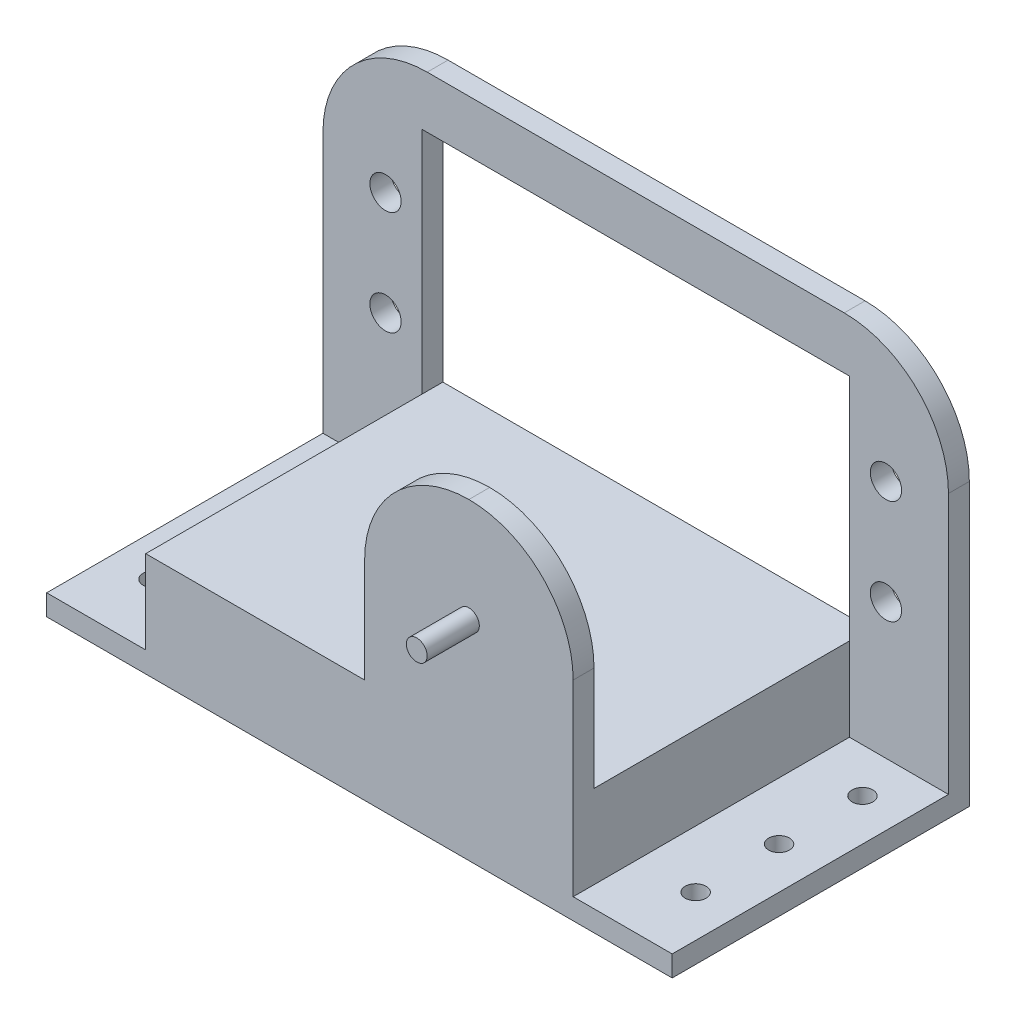
ISO-10303-21;
HEADER;
FILE_DESCRIPTION(('STEP AP214'),'2;1');
FILE_NAME('part.step','',(''),(''),'','','');
FILE_SCHEMA(('AUTOMOTIVE_DESIGN { 1 0 10303 214 1 1 1 1 }'));
ENDSEC;
DATA;
#1=APPLICATION_CONTEXT('core data for automotive mechanical design processes');
#2=APPLICATION_PROTOCOL_DEFINITION('international standard','automotive_design',2000,#1);
#3=PRODUCT_CONTEXT('',#1,'mechanical');
#4=PRODUCT('Part','Part','',(#3));
#5=PRODUCT_RELATED_PRODUCT_CATEGORY('part','',(#4));
#6=PRODUCT_DEFINITION_FORMATION('','',#4);
#7=PRODUCT_DEFINITION_CONTEXT('part definition',#1,'design');
#8=PRODUCT_DEFINITION('design','',#6,#7);
#9=PRODUCT_DEFINITION_SHAPE('','',#8);
#10=(LENGTH_UNIT() NAMED_UNIT(*) SI_UNIT(.MILLI.,.METRE.));
#11=(NAMED_UNIT(*) PLANE_ANGLE_UNIT() SI_UNIT($,.RADIAN.));
#12=(NAMED_UNIT(*) SI_UNIT($,.STERADIAN.) SOLID_ANGLE_UNIT());
#13=UNCERTAINTY_MEASURE_WITH_UNIT(LENGTH_MEASURE(1.E-05),#10,'distance_accuracy_value','');
#14=(GEOMETRIC_REPRESENTATION_CONTEXT(3) GLOBAL_UNCERTAINTY_ASSIGNED_CONTEXT((#13)) GLOBAL_UNIT_ASSIGNED_CONTEXT((#10,
#11,#12)) REPRESENTATION_CONTEXT('',''));
#15=CARTESIAN_POINT('',(0.,0.,0.));
#16=DIRECTION('',(0.,0.,1.));
#17=DIRECTION('',(1.,0.,0.));
#18=AXIS2_PLACEMENT_3D('',#15,#16,#17);
#19=CARTESIAN_POINT('',(0.,10.,0.));
#20=DIRECTION('',(0.,1.,0.));
#21=DIRECTION('',(0.,0.,1.));
#22=AXIS2_PLACEMENT_3D('',#19,#20,#21);
#23=PLANE('',#22);
#24=DIRECTION('',(0.,0.,1.));
#25=VECTOR('',#24,1.);
#26=CARTESIAN_POINT('',(0.499999999999994,10.,14.25));
#27=LINE('',#26,#25);
#28=CARTESIAN_POINT('',(0.499999999999994,10.,12.25));
#29=VERTEX_POINT('',#28);
#30=CARTESIAN_POINT('',(0.499999999999994,10.,14.25));
#31=VERTEX_POINT('',#30);
#32=EDGE_CURVE('E203',#29,#31,#27,.T.);
#33=ORIENTED_EDGE('',*,*,#32,.F.);
#34=DIRECTION('',(-1.,0.,0.));
#35=VECTOR('',#34,1.);
#36=CARTESIAN_POINT('',(20.5,10.,12.25));
#37=LINE('',#36,#35);
#38=CARTESIAN_POINT('',(20.5,10.,12.25));
#39=VERTEX_POINT('',#38);
#40=EDGE_CURVE('E200',#39,#29,#37,.T.);
#41=ORIENTED_EDGE('',*,*,#40,.F.);
#42=DIRECTION('',(0.,0.,-1.));
#43=VECTOR('',#42,1.);
#44=CARTESIAN_POINT('',(20.5,10.,-14.25));
#45=LINE('',#44,#43);
#46=CARTESIAN_POINT('',(20.5,10.,-12.25));
#47=VERTEX_POINT('',#46);
#48=EDGE_CURVE('E220',#39,#47,#45,.T.);
#49=ORIENTED_EDGE('',*,*,#48,.T.);
#50=DIRECTION('',(0.,0.,-1.));
#51=VECTOR('',#50,1.);
#52=CARTESIAN_POINT('',(20.5,10.,34.2795604965274));
#53=LINE('',#52,#51);
#54=CARTESIAN_POINT('',(20.5,10.,-14.25));
#55=VERTEX_POINT('',#54);
#56=EDGE_CURVE('E178',#47,#55,#53,.T.);
#57=ORIENTED_EDGE('',*,*,#56,.T.);
#58=DIRECTION('',(-1.,0.,0.));
#59=VECTOR('',#58,1.);
#60=CARTESIAN_POINT('',(20.5,10.,-14.25));
#61=LINE('',#60,#59);
#62=CARTESIAN_POINT('',(-20.5,10.,-14.25));
#63=VERTEX_POINT('',#62);
#64=EDGE_CURVE('E182',#55,#63,#61,.T.);
#65=ORIENTED_EDGE('',*,*,#64,.T.);
#66=DIRECTION('',(0.,0.,-1.));
#67=VECTOR('',#66,1.);
#68=CARTESIAN_POINT('',(-20.5,10.,34.2795604965274));
#69=LINE('',#68,#67);
#70=CARTESIAN_POINT('',(-20.5,10.,-12.25));
#71=VERTEX_POINT('',#70);
#72=EDGE_CURVE('E166',#71,#63,#69,.T.);
#73=ORIENTED_EDGE('',*,*,#72,.F.);
#74=DIRECTION('',(0.,0.,1.));
#75=VECTOR('',#74,1.);
#76=CARTESIAN_POINT('',(-20.5,10.,-14.25));
#77=LINE('',#76,#75);
#78=CARTESIAN_POINT('',(-20.5,10.,14.25));
#79=VERTEX_POINT('',#78);
#80=EDGE_CURVE('E214',#71,#79,#77,.T.);
#81=ORIENTED_EDGE('',*,*,#80,.T.);
#82=DIRECTION('',(1.,0.,0.));
#83=VECTOR('',#82,1.);
#84=CARTESIAN_POINT('',(-20.5,10.,14.25));
#85=LINE('',#84,#83);
#86=EDGE_CURVE('E216',#79,#31,#85,.T.);
#87=ORIENTED_EDGE('',*,*,#86,.T.);
#88=EDGE_LOOP('',(#33,#41,#49,#57,#65,#73,#81,#87));
#89=FACE_BOUND('',#88,.T.);
#90=ADVANCED_FACE('F35',(#89),#23,.T.);
#91=CARTESIAN_POINT('',(0.,2.,0.));
#92=DIRECTION('',(0.,1.,0.));
#93=DIRECTION('',(0.,0.,1.));
#94=AXIS2_PLACEMENT_3D('',#91,#92,#93);
#95=PLANE('',#94);
#96=CARTESIAN_POINT('',(-26.,2.,-8.));
#97=DIRECTION('',(0.,1.,0.));
#98=DIRECTION('',(0.,0.,1.));
#99=AXIS2_PLACEMENT_3D('',#96,#97,#98);
#100=CIRCLE('',#99,1.);
#101=CARTESIAN_POINT('',(-26.,2.,-7.));
#102=VERTEX_POINT('',#101);
#103=EDGE_CURVE('E412',#102,#102,#100,.T.);
#104=ORIENTED_EDGE('',*,*,#103,.F.);
#105=EDGE_LOOP('',(#104));
#106=FACE_BOUND('',#105,.T.);
#107=CARTESIAN_POINT('',(-26.,2.,8.));
#108=DIRECTION('',(0.,1.,0.));
#109=DIRECTION('',(0.,0.,-1.));
#110=AXIS2_PLACEMENT_3D('',#107,#108,#109);
#111=CIRCLE('',#110,1.);
#112=CARTESIAN_POINT('',(-26.,2.,7.));
#113=VERTEX_POINT('',#112);
#114=EDGE_CURVE('E413',#113,#113,#111,.T.);
#115=ORIENTED_EDGE('',*,*,#114,.F.);
#116=EDGE_LOOP('',(#115));
#117=FACE_BOUND('',#116,.T.);
#118=CARTESIAN_POINT('',(-26.,2.,0.));
#119=DIRECTION('',(0.,1.,0.));
#120=DIRECTION('',(0.,0.,1.));
#121=AXIS2_PLACEMENT_3D('',#118,#119,#120);
#122=CIRCLE('',#121,1.);
#123=CARTESIAN_POINT('',(-26.,2.,1.));
#124=VERTEX_POINT('',#123);
#125=EDGE_CURVE('E405',#124,#124,#122,.T.);
#126=ORIENTED_EDGE('',*,*,#125,.F.);
#127=EDGE_LOOP('',(#126));
#128=FACE_BOUND('',#127,.T.);
#129=DIRECTION('',(1.,0.,0.));
#130=VECTOR('',#129,1.);
#131=CARTESIAN_POINT('',(-30.,2.,14.25));
#132=LINE('',#131,#130);
#133=CARTESIAN_POINT('',(-30.,2.,14.25));
#134=VERTEX_POINT('',#133);
#135=CARTESIAN_POINT('',(-20.5,2.,14.25));
#136=VERTEX_POINT('',#135);
#137=EDGE_CURVE('E251',#134,#136,#132,.T.);
#138=ORIENTED_EDGE('',*,*,#137,.T.);
#139=DIRECTION('',(0.,0.,1.));
#140=VECTOR('',#139,1.);
#141=CARTESIAN_POINT('',(-20.5,2.,-14.25));
#142=LINE('',#141,#140);
#143=CARTESIAN_POINT('',(-20.5,2.,-12.25));
#144=VERTEX_POINT('',#143);
#145=EDGE_CURVE('E213',#144,#136,#142,.T.);
#146=ORIENTED_EDGE('',*,*,#145,.F.);
#147=DIRECTION('',(1.,0.,0.));
#148=VECTOR('',#147,1.);
#149=CARTESIAN_POINT('',(-30.,2.,-12.25));
#150=LINE('',#149,#148);
#151=CARTESIAN_POINT('',(-30.,2.,-12.25));
#152=VERTEX_POINT('',#151);
#153=EDGE_CURVE('E234',#152,#144,#150,.T.);
#154=ORIENTED_EDGE('',*,*,#153,.F.);
#155=DIRECTION('',(0.,0.,1.));
#156=VECTOR('',#155,1.);
#157=CARTESIAN_POINT('',(-30.,2.,-14.25));
#158=LINE('',#157,#156);
#159=EDGE_CURVE('E247',#152,#134,#158,.T.);
#160=ORIENTED_EDGE('',*,*,#159,.T.);
#161=EDGE_LOOP('',(#138,#146,#154,#160));
#162=FACE_BOUND('',#161,.T.);
#163=ADVANCED_FACE('F325',(#106,#117,#128,#162),#95,.T.);
#164=CARTESIAN_POINT('',(26.,2.,-8.));
#165=DIRECTION('',(0.,-1.,0.));
#166=DIRECTION('',(0.,0.,1.));
#167=AXIS2_PLACEMENT_3D('',#164,#165,#166);
#168=CIRCLE('',#167,1.);
#169=CARTESIAN_POINT('',(26.,2.,-7.));
#170=VERTEX_POINT('',#169);
#171=EDGE_CURVE('E430',#170,#170,#168,.T.);
#172=ORIENTED_EDGE('',*,*,#171,.T.);
#173=EDGE_LOOP('',(#172));
#174=FACE_BOUND('',#173,.T.);
#175=CARTESIAN_POINT('',(26.,2.,8.));
#176=DIRECTION('',(0.,-1.,0.));
#177=DIRECTION('',(0.,0.,-1.));
#178=AXIS2_PLACEMENT_3D('',#175,#176,#177);
#179=CIRCLE('',#178,1.);
#180=CARTESIAN_POINT('',(26.,2.,7.));
#181=VERTEX_POINT('',#180);
#182=EDGE_CURVE('E431',#181,#181,#179,.T.);
#183=ORIENTED_EDGE('',*,*,#182,.T.);
#184=EDGE_LOOP('',(#183));
#185=FACE_BOUND('',#184,.T.);
#186=CARTESIAN_POINT('',(26.,2.,0.));
#187=DIRECTION('',(0.,-1.,0.));
#188=DIRECTION('',(0.,0.,1.));
#189=AXIS2_PLACEMENT_3D('',#186,#187,#188);
#190=CIRCLE('',#189,1.);
#191=CARTESIAN_POINT('',(26.,2.,1.));
#192=VERTEX_POINT('',#191);
#193=EDGE_CURVE('E423',#192,#192,#190,.T.);
#194=ORIENTED_EDGE('',*,*,#193,.T.);
#195=EDGE_LOOP('',(#194));
#196=FACE_BOUND('',#195,.T.);
#197=CARTESIAN_POINT('',(20.5,2.,-12.25));
#198=VERTEX_POINT('',#197);
#199=CARTESIAN_POINT('',(30.,2.,-12.25));
#200=VERTEX_POINT('',#199);
#201=EDGE_CURVE('E229',#198,#200,#150,.T.);
#202=ORIENTED_EDGE('',*,*,#201,.F.);
#203=DIRECTION('',(0.,0.,-1.));
#204=VECTOR('',#203,1.);
#205=CARTESIAN_POINT('',(20.5,2.,-14.25));
#206=LINE('',#205,#204);
#207=CARTESIAN_POINT('',(20.5,2.,14.25));
#208=VERTEX_POINT('',#207);
#209=EDGE_CURVE('E217',#208,#198,#206,.T.);
#210=ORIENTED_EDGE('',*,*,#209,.F.);
#211=CARTESIAN_POINT('',(30.,2.,14.25));
#212=VERTEX_POINT('',#211);
#213=EDGE_CURVE('E250',#208,#212,#132,.T.);
#214=ORIENTED_EDGE('',*,*,#213,.T.);
#215=DIRECTION('',(0.,0.,-1.));
#216=VECTOR('',#215,1.);
#217=CARTESIAN_POINT('',(30.,2.,-14.25));
#218=LINE('',#217,#216);
#219=EDGE_CURVE('E244',#212,#200,#218,.T.);
#220=ORIENTED_EDGE('',*,*,#219,.T.);
#221=EDGE_LOOP('',(#202,#210,#214,#220));
#222=FACE_BOUND('',#221,.T.);
#223=ADVANCED_FACE('F362',(#174,#185,#196,#222),#95,.T.);
#224=CARTESIAN_POINT('',(-30.,37.,-12.25));
#225=DIRECTION('',(0.,0.,-1.));
#226=DIRECTION('',(-1.,0.,0.));
#227=AXIS2_PLACEMENT_3D('',#224,#225,#226);
#228=PLANE('',#227);
#229=CARTESIAN_POINT('',(-24.,15.,-12.25));
#230=DIRECTION('',(0.,0.,-1.));
#231=DIRECTION('',(-1.,0.,0.));
#232=AXIS2_PLACEMENT_3D('',#229,#230,#231);
#233=CIRCLE('',#232,1.5);
#234=CARTESIAN_POINT('',(-25.5,15.,-12.25));
#235=VERTEX_POINT('',#234);
#236=EDGE_CURVE('E395',#235,#235,#233,.T.);
#237=ORIENTED_EDGE('',*,*,#236,.T.);
#238=EDGE_LOOP('',(#237));
#239=FACE_BOUND('',#238,.T.);
#240=CARTESIAN_POINT('',(-24.,25.,-12.25));
#241=DIRECTION('',(0.,0.,-1.));
#242=DIRECTION('',(-1.,0.,0.));
#243=AXIS2_PLACEMENT_3D('',#240,#241,#242);
#244=CIRCLE('',#243,1.5);
#245=CARTESIAN_POINT('',(-25.5,25.,-12.25));
#246=VERTEX_POINT('',#245);
#247=EDGE_CURVE('E389',#246,#246,#244,.T.);
#248=ORIENTED_EDGE('',*,*,#247,.T.);
#249=EDGE_LOOP('',(#248));
#250=FACE_BOUND('',#249,.T.);
#251=CARTESIAN_POINT('',(24.,15.,-12.25));
#252=DIRECTION('',(0.,0.,-1.));
#253=DIRECTION('',(-1.,0.,0.));
#254=AXIS2_PLACEMENT_3D('',#251,#252,#253);
#255=CIRCLE('',#254,1.5);
#256=CARTESIAN_POINT('',(22.5,15.,-12.25));
#257=VERTEX_POINT('',#256);
#258=EDGE_CURVE('E381',#257,#257,#255,.F.);
#259=ORIENTED_EDGE('',*,*,#258,.F.);
#260=EDGE_LOOP('',(#259));
#261=FACE_BOUND('',#260,.T.);
#262=CARTESIAN_POINT('',(24.,25.,-12.25));
#263=DIRECTION('',(0.,0.,-1.));
#264=DIRECTION('',(-1.,0.,0.));
#265=AXIS2_PLACEMENT_3D('',#262,#263,#264);
#266=CIRCLE('',#265,1.5);
#267=CARTESIAN_POINT('',(22.5,25.,-12.25));
#268=VERTEX_POINT('',#267);
#269=EDGE_CURVE('E374',#268,#268,#266,.F.);
#270=ORIENTED_EDGE('',*,*,#269,.F.);
#271=EDGE_LOOP('',(#270));
#272=FACE_BOUND('',#271,.T.);
#273=DIRECTION('',(1.,0.,0.));
#274=VECTOR('',#273,1.);
#275=CARTESIAN_POINT('',(-30.,37.,-12.25));
#276=LINE('',#275,#274);
#277=CARTESIAN_POINT('',(-20.,37.,-12.25));
#278=VERTEX_POINT('',#277);
#279=CARTESIAN_POINT('',(20.,37.,-12.25));
#280=VERTEX_POINT('',#279);
#281=EDGE_CURVE('E230',#278,#280,#276,.T.);
#282=ORIENTED_EDGE('',*,*,#281,.F.);
#283=CARTESIAN_POINT('',(-20.,27.,-12.25));
#284=DIRECTION('',(0.,0.,-1.));
#285=DIRECTION('',(-1.,0.,0.));
#286=AXIS2_PLACEMENT_3D('',#283,#284,#285);
#287=CIRCLE('',#286,10.);
#288=CARTESIAN_POINT('',(-30.,27.,-12.25));
#289=VERTEX_POINT('',#288);
#290=EDGE_CURVE('E306',#278,#289,#287,.F.);
#291=ORIENTED_EDGE('',*,*,#290,.T.);
#292=DIRECTION('',(0.,-1.,0.));
#293=VECTOR('',#292,1.);
#294=CARTESIAN_POINT('',(-30.,37.,-12.25));
#295=LINE('',#294,#293);
#296=EDGE_CURVE('E241',#289,#152,#295,.T.);
#297=ORIENTED_EDGE('',*,*,#296,.T.);
#298=ORIENTED_EDGE('',*,*,#153,.T.);
#299=DIRECTION('',(0.,-1.,0.));
#300=VECTOR('',#299,1.);
#301=CARTESIAN_POINT('',(-20.5,37.,-12.25));
#302=LINE('',#301,#300);
#303=EDGE_CURVE('E275',#71,#144,#302,.T.);
#304=ORIENTED_EDGE('',*,*,#303,.F.);
#305=DIRECTION('',(0.,-1.,0.));
#306=VECTOR('',#305,1.);
#307=CARTESIAN_POINT('',(-20.5,10.,-12.25));
#308=LINE('',#307,#306);
#309=CARTESIAN_POINT('',(-20.5,32.,-12.25));
#310=VERTEX_POINT('',#309);
#311=EDGE_CURVE('E174',#310,#71,#308,.T.);
#312=ORIENTED_EDGE('',*,*,#311,.F.);
#313=DIRECTION('',(-1.,0.,0.));
#314=VECTOR('',#313,1.);
#315=CARTESIAN_POINT('',(20.5,32.,-12.25));
#316=LINE('',#315,#314);
#317=CARTESIAN_POINT('',(20.5,32.,-12.25));
#318=VERTEX_POINT('',#317);
#319=EDGE_CURVE('E367',#318,#310,#316,.T.);
#320=ORIENTED_EDGE('',*,*,#319,.F.);
#321=DIRECTION('',(0.,1.,0.));
#322=VECTOR('',#321,1.);
#323=CARTESIAN_POINT('',(20.5,10.,-12.25));
#324=LINE('',#323,#322);
#325=EDGE_CURVE('E204',#47,#318,#324,.T.);
#326=ORIENTED_EDGE('',*,*,#325,.F.);
#327=DIRECTION('',(0.,1.,0.));
#328=VECTOR('',#327,1.);
#329=CARTESIAN_POINT('',(20.5,37.,-12.25));
#330=LINE('',#329,#328);
#331=EDGE_CURVE('E272',#198,#47,#330,.T.);
#332=ORIENTED_EDGE('',*,*,#331,.F.);
#333=ORIENTED_EDGE('',*,*,#201,.T.);
#334=DIRECTION('',(0.,-1.,0.));
#335=VECTOR('',#334,1.);
#336=CARTESIAN_POINT('',(30.,37.,-12.25));
#337=LINE('',#336,#335);
#338=CARTESIAN_POINT('',(30.,27.,-12.25));
#339=VERTEX_POINT('',#338);
#340=EDGE_CURVE('E237',#339,#200,#337,.T.);
#341=ORIENTED_EDGE('',*,*,#340,.F.);
#342=CARTESIAN_POINT('',(20.,27.,-12.25));
#343=DIRECTION('',(0.,0.,-1.));
#344=DIRECTION('',(-1.,0.,0.));
#345=AXIS2_PLACEMENT_3D('',#342,#343,#344);
#346=CIRCLE('',#345,10.);
#347=EDGE_CURVE('E304',#339,#280,#346,.F.);
#348=ORIENTED_EDGE('',*,*,#347,.T.);
#349=EDGE_LOOP('',(#282,#291,#297,#298,#304,#312,#320,#326,#332,#333,#341,#348));
#350=FACE_BOUND('',#349,.T.);
#351=ADVANCED_FACE('F318',(#239,#250,#261,#272,#350),#228,.F.);
#352=CARTESIAN_POINT('',(30.,2.,-14.25));
#353=DIRECTION('',(-1.,0.,0.));
#354=DIRECTION('',(0.,0.,1.));
#355=AXIS2_PLACEMENT_3D('',#352,#353,#354);
#356=PLANE('',#355);
#357=DIRECTION('',(0.,-1.,0.));
#358=VECTOR('',#357,1.);
#359=CARTESIAN_POINT('',(30.,2.,-14.25));
#360=LINE('',#359,#358);
#361=CARTESIAN_POINT('',(30.,27.,-14.25));
#362=VERTEX_POINT('',#361);
#363=CARTESIAN_POINT('',(30.,0.,-14.25));
#364=VERTEX_POINT('',#363);
#365=EDGE_CURVE('E270',#362,#364,#360,.T.);
#366=ORIENTED_EDGE('',*,*,#365,.F.);
#367=DIRECTION('',(0.,0.,-1.));
#368=VECTOR('',#367,1.);
#369=CARTESIAN_POINT('',(30.,27.,-12.25));
#370=LINE('',#369,#368);
#371=EDGE_CURVE('E11',#362,#339,#370,.F.);
#372=ORIENTED_EDGE('',*,*,#371,.T.);
#373=ORIENTED_EDGE('',*,*,#340,.T.);
#374=ORIENTED_EDGE('',*,*,#219,.F.);
#375=DIRECTION('',(0.,-1.,0.));
#376=VECTOR('',#375,1.);
#377=CARTESIAN_POINT('',(30.,2.,14.25));
#378=LINE('',#377,#376);
#379=CARTESIAN_POINT('',(30.,0.,14.25));
#380=VERTEX_POINT('',#379);
#381=EDGE_CURVE('E254',#212,#380,#378,.T.);
#382=ORIENTED_EDGE('',*,*,#381,.T.);
#383=DIRECTION('',(0.,0.,-1.));
#384=VECTOR('',#383,1.);
#385=CARTESIAN_POINT('',(30.,0.,-14.25));
#386=LINE('',#385,#384);
#387=EDGE_CURVE('E243',#380,#364,#386,.T.);
#388=ORIENTED_EDGE('',*,*,#387,.T.);
#389=EDGE_LOOP('',(#366,#372,#373,#374,#382,#388));
#390=FACE_BOUND('',#389,.T.);
#391=ADVANCED_FACE('F471',(#390),#356,.F.);
#392=CARTESIAN_POINT('',(-30.,2.,-14.25));
#393=DIRECTION('',(0.,0.,1.));
#394=DIRECTION('',(1.,0.,0.));
#395=AXIS2_PLACEMENT_3D('',#392,#393,#394);
#396=PLANE('',#395);
#397=CARTESIAN_POINT('',(-24.,15.,-14.25));
#398=DIRECTION('',(0.,0.,1.));
#399=DIRECTION('',(-1.,0.,0.));
#400=AXIS2_PLACEMENT_3D('',#397,#398,#399);
#401=CIRCLE('',#400,1.5);
#402=CARTESIAN_POINT('',(-25.5,15.,-14.25));
#403=VERTEX_POINT('',#402);
#404=EDGE_CURVE('E398',#403,#403,#401,.T.);
#405=ORIENTED_EDGE('',*,*,#404,.T.);
#406=EDGE_LOOP('',(#405));
#407=FACE_BOUND('',#406,.T.);
#408=CARTESIAN_POINT('',(-24.,25.,-14.25));
#409=DIRECTION('',(0.,0.,1.));
#410=DIRECTION('',(1.,0.,0.));
#411=AXIS2_PLACEMENT_3D('',#408,#409,#410);
#412=CIRCLE('',#411,1.5);
#413=CARTESIAN_POINT('',(-22.5,25.,-14.25));
#414=VERTEX_POINT('',#413);
#415=EDGE_CURVE('E392',#414,#414,#412,.T.);
#416=ORIENTED_EDGE('',*,*,#415,.T.);
#417=EDGE_LOOP('',(#416));
#418=FACE_BOUND('',#417,.T.);
#419=CARTESIAN_POINT('',(24.,15.,-14.25));
#420=DIRECTION('',(0.,0.,-1.));
#421=DIRECTION('',(1.,0.,0.));
#422=AXIS2_PLACEMENT_3D('',#419,#420,#421);
#423=CIRCLE('',#422,1.5);
#424=CARTESIAN_POINT('',(25.5,15.,-14.25));
#425=VERTEX_POINT('',#424);
#426=EDGE_CURVE('E386',#425,#425,#423,.T.);
#427=ORIENTED_EDGE('',*,*,#426,.F.);
#428=EDGE_LOOP('',(#427));
#429=FACE_BOUND('',#428,.T.);
#430=CARTESIAN_POINT('',(24.,25.,-14.25));
#431=DIRECTION('',(0.,0.,-1.));
#432=DIRECTION('',(-1.,0.,0.));
#433=AXIS2_PLACEMENT_3D('',#430,#431,#432);
#434=CIRCLE('',#433,1.5);
#435=CARTESIAN_POINT('',(22.5,25.,-14.25));
#436=VERTEX_POINT('',#435);
#437=EDGE_CURVE('E376',#436,#436,#434,.T.);
#438=ORIENTED_EDGE('',*,*,#437,.F.);
#439=EDGE_LOOP('',(#438));
#440=FACE_BOUND('',#439,.T.);
#441=ORIENTED_EDGE('',*,*,#64,.F.);
#442=DIRECTION('',(0.,-1.,0.));
#443=VECTOR('',#442,1.);
#444=CARTESIAN_POINT('',(20.5,10.,-14.25));
#445=LINE('',#444,#443);
#446=CARTESIAN_POINT('',(20.5,32.,-14.25));
#447=VERTEX_POINT('',#446);
#448=EDGE_CURVE('E187',#447,#55,#445,.T.);
#449=ORIENTED_EDGE('',*,*,#448,.F.);
#450=DIRECTION('',(1.,0.,0.));
#451=VECTOR('',#450,1.);
#452=CARTESIAN_POINT('',(20.5,32.,-14.25));
#453=LINE('',#452,#451);
#454=CARTESIAN_POINT('',(-20.5,32.,-14.25));
#455=VERTEX_POINT('',#454);
#456=EDGE_CURVE('E191',#455,#447,#453,.T.);
#457=ORIENTED_EDGE('',*,*,#456,.F.);
#458=DIRECTION('',(0.,1.,0.));
#459=VECTOR('',#458,1.);
#460=CARTESIAN_POINT('',(-20.5,10.,-14.25));
#461=LINE('',#460,#459);
#462=EDGE_CURVE('E171',#63,#455,#461,.T.);
#463=ORIENTED_EDGE('',*,*,#462,.F.);
#464=EDGE_LOOP('',(#441,#449,#457,#463));
#465=FACE_BOUND('',#464,.T.);
#466=DIRECTION('',(0.,-1.,0.));
#467=VECTOR('',#466,1.);
#468=CARTESIAN_POINT('',(-30.,2.,-14.25));
#469=LINE('',#468,#467);
#470=CARTESIAN_POINT('',(-30.,27.,-14.25));
#471=VERTEX_POINT('',#470);
#472=CARTESIAN_POINT('',(-30.,0.,-14.25));
#473=VERTEX_POINT('',#472);
#474=EDGE_CURVE('E268',#471,#473,#469,.T.);
#475=ORIENTED_EDGE('',*,*,#474,.F.);
#476=CARTESIAN_POINT('',(-20.,27.,-14.25));
#477=DIRECTION('',(0.,0.,1.));
#478=DIRECTION('',(1.,0.,0.));
#479=AXIS2_PLACEMENT_3D('',#476,#477,#478);
#480=CIRCLE('',#479,10.);
#481=CARTESIAN_POINT('',(-20.,37.,-14.25));
#482=VERTEX_POINT('',#481);
#483=EDGE_CURVE('E43',#471,#482,#480,.F.);
#484=ORIENTED_EDGE('',*,*,#483,.T.);
#485=DIRECTION('',(-1.,0.,0.));
#486=VECTOR('',#485,1.);
#487=CARTESIAN_POINT('',(-30.,37.,-14.25));
#488=LINE('',#487,#486);
#489=CARTESIAN_POINT('',(20.,37.,-14.25));
#490=VERTEX_POINT('',#489);
#491=EDGE_CURVE('E233',#490,#482,#488,.T.);
#492=ORIENTED_EDGE('',*,*,#491,.F.);
#493=CARTESIAN_POINT('',(20.,27.,-14.25));
#494=DIRECTION('',(0.,0.,1.));
#495=DIRECTION('',(1.,0.,0.));
#496=AXIS2_PLACEMENT_3D('',#493,#494,#495);
#497=CIRCLE('',#496,10.);
#498=EDGE_CURVE('E50',#490,#362,#497,.F.);
#499=ORIENTED_EDGE('',*,*,#498,.T.);
#500=ORIENTED_EDGE('',*,*,#365,.T.);
#501=DIRECTION('',(-1.,0.,0.));
#502=VECTOR('',#501,1.);
#503=CARTESIAN_POINT('',(-30.,0.,-14.25));
#504=LINE('',#503,#502);
#505=EDGE_CURVE('E257',#364,#473,#504,.T.);
#506=ORIENTED_EDGE('',*,*,#505,.T.);
#507=EDGE_LOOP('',(#475,#484,#492,#499,#500,#506));
#508=FACE_BOUND('',#507,.T.);
#509=ADVANCED_FACE('F189',(#407,#418,#429,#440,#465,#508),#396,.F.);
#510=CARTESIAN_POINT('',(-30.,2.,-14.25));
#511=DIRECTION('',(1.,0.,0.));
#512=DIRECTION('',(0.,0.,-1.));
#513=AXIS2_PLACEMENT_3D('',#510,#511,#512);
#514=PLANE('',#513);
#515=ORIENTED_EDGE('',*,*,#296,.F.);
#516=DIRECTION('',(0.,0.,1.));
#517=VECTOR('',#516,1.);
#518=CARTESIAN_POINT('',(-30.,27.,-14.25));
#519=LINE('',#518,#517);
#520=EDGE_CURVE('E58',#289,#471,#519,.F.);
#521=ORIENTED_EDGE('',*,*,#520,.T.);
#522=ORIENTED_EDGE('',*,*,#474,.T.);
#523=DIRECTION('',(0.,0.,1.));
#524=VECTOR('',#523,1.);
#525=CARTESIAN_POINT('',(-30.,0.,-14.25));
#526=LINE('',#525,#524);
#527=CARTESIAN_POINT('',(-30.,0.,14.25));
#528=VERTEX_POINT('',#527);
#529=EDGE_CURVE('E260',#473,#528,#526,.T.);
#530=ORIENTED_EDGE('',*,*,#529,.T.);
#531=DIRECTION('',(0.,-1.,0.));
#532=VECTOR('',#531,1.);
#533=CARTESIAN_POINT('',(-30.,2.,14.25));
#534=LINE('',#533,#532);
#535=EDGE_CURVE('E265',#134,#528,#534,.T.);
#536=ORIENTED_EDGE('',*,*,#535,.F.);
#537=ORIENTED_EDGE('',*,*,#159,.F.);
#538=EDGE_LOOP('',(#515,#521,#522,#530,#536,#537));
#539=FACE_BOUND('',#538,.T.);
#540=ADVANCED_FACE('F321',(#539),#514,.F.);
#541=CARTESIAN_POINT('',(-30.,2.,14.25));
#542=DIRECTION('',(0.,0.,-1.));
#543=DIRECTION('',(-1.,0.,0.));
#544=AXIS2_PLACEMENT_3D('',#541,#542,#543);
#545=PLANE('',#544);
#546=CARTESIAN_POINT('',(10.5,20.,14.25));
#547=DIRECTION('',(0.,0.,-1.));
#548=DIRECTION('',(-1.,0.,0.));
#549=AXIS2_PLACEMENT_3D('',#546,#547,#548);
#550=CIRCLE('',#549,1.);
#551=CARTESIAN_POINT('',(9.5,20.,14.25));
#552=VERTEX_POINT('',#551);
#553=EDGE_CURVE('E277',#552,#552,#550,.F.);
#554=ORIENTED_EDGE('',*,*,#553,.F.);
#555=EDGE_LOOP('',(#554));
#556=FACE_BOUND('',#555,.T.);
#557=CARTESIAN_POINT('',(10.5,20.,14.25));
#558=DIRECTION('',(0.,0.,-1.));
#559=DIRECTION('',(-1.,0.,0.));
#560=AXIS2_PLACEMENT_3D('',#557,#558,#559);
#561=CIRCLE('',#560,10.);
#562=CARTESIAN_POINT('',(20.5,20.,14.25));
#563=VERTEX_POINT('',#562);
#564=CARTESIAN_POINT('',(10.5,30.,14.25));
#565=VERTEX_POINT('',#564);
#566=EDGE_CURVE('E280',#563,#565,#561,.F.);
#567=ORIENTED_EDGE('',*,*,#566,.T.);
#568=CARTESIAN_POINT('',(10.5,20.,14.25));
#569=DIRECTION('',(0.,0.,-1.));
#570=DIRECTION('',(-1.,0.,0.));
#571=AXIS2_PLACEMENT_3D('',#568,#569,#570);
#572=CIRCLE('',#571,10.);
#573=CARTESIAN_POINT('',(0.499999999999994,20.,14.25));
#574=VERTEX_POINT('',#573);
#575=EDGE_CURVE('E282',#565,#574,#572,.F.);
#576=ORIENTED_EDGE('',*,*,#575,.T.);
#577=DIRECTION('',(0.,-1.,0.));
#578=VECTOR('',#577,1.);
#579=CARTESIAN_POINT('',(0.499999999999994,30.,14.25));
#580=LINE('',#579,#578);
#581=EDGE_CURVE('E207',#574,#31,#580,.T.);
#582=ORIENTED_EDGE('',*,*,#581,.T.);
#583=ORIENTED_EDGE('',*,*,#86,.F.);
#584=DIRECTION('',(0.,-1.,0.));
#585=VECTOR('',#584,1.);
#586=CARTESIAN_POINT('',(-20.5,10.,14.25));
#587=LINE('',#586,#585);
#588=EDGE_CURVE('E226',#79,#136,#587,.T.);
#589=ORIENTED_EDGE('',*,*,#588,.T.);
#590=ORIENTED_EDGE('',*,*,#137,.F.);
#591=ORIENTED_EDGE('',*,*,#535,.T.);
#592=DIRECTION('',(1.,0.,0.));
#593=VECTOR('',#592,1.);
#594=CARTESIAN_POINT('',(-30.,0.,14.25));
#595=LINE('',#594,#593);
#596=EDGE_CURVE('E248',#528,#380,#595,.T.);
#597=ORIENTED_EDGE('',*,*,#596,.T.);
#598=ORIENTED_EDGE('',*,*,#381,.F.);
#599=ORIENTED_EDGE('',*,*,#213,.F.);
#600=DIRECTION('',(0.,-1.,0.));
#601=VECTOR('',#600,1.);
#602=CARTESIAN_POINT('',(20.5,10.,14.25));
#603=LINE('',#602,#601);
#604=EDGE_CURVE('E222',#563,#208,#603,.T.);
#605=ORIENTED_EDGE('',*,*,#604,.F.);
#606=EDGE_LOOP('',(#567,#576,#582,#583,#589,#590,#591,#597,#598,#599,#605));
#607=FACE_BOUND('',#606,.T.);
#608=ADVANCED_FACE('F334',(#556,#607),#545,.F.);
#609=CARTESIAN_POINT('',(0.,0.,0.));
#610=DIRECTION('',(0.,1.,0.));
#611=DIRECTION('',(0.,0.,1.));
#612=AXIS2_PLACEMENT_3D('',#609,#610,#611);
#613=PLANE('',#612);
#614=CARTESIAN_POINT('',(26.,0.,-8.));
#615=DIRECTION('',(0.,1.,0.));
#616=DIRECTION('',(0.,0.,1.));
#617=AXIS2_PLACEMENT_3D('',#614,#615,#616);
#618=CIRCLE('',#617,1.);
#619=CARTESIAN_POINT('',(26.,0.,-7.));
#620=VERTEX_POINT('',#619);
#621=EDGE_CURVE('E426',#620,#620,#618,.T.);
#622=ORIENTED_EDGE('',*,*,#621,.T.);
#623=EDGE_LOOP('',(#622));
#624=FACE_BOUND('',#623,.T.);
#625=CARTESIAN_POINT('',(26.,0.,8.));
#626=DIRECTION('',(0.,1.,0.));
#627=DIRECTION('',(0.,0.,1.));
#628=AXIS2_PLACEMENT_3D('',#625,#626,#627);
#629=CIRCLE('',#628,1.);
#630=CARTESIAN_POINT('',(26.,0.,9.));
#631=VERTEX_POINT('',#630);
#632=EDGE_CURVE('E427',#631,#631,#629,.T.);
#633=ORIENTED_EDGE('',*,*,#632,.T.);
#634=EDGE_LOOP('',(#633));
#635=FACE_BOUND('',#634,.T.);
#636=CARTESIAN_POINT('',(26.,0.,0.));
#637=DIRECTION('',(0.,1.,0.));
#638=DIRECTION('',(0.,0.,1.));
#639=AXIS2_PLACEMENT_3D('',#636,#637,#638);
#640=CIRCLE('',#639,1.);
#641=CARTESIAN_POINT('',(26.,0.,1.));
#642=VERTEX_POINT('',#641);
#643=EDGE_CURVE('E416',#642,#642,#640,.T.);
#644=ORIENTED_EDGE('',*,*,#643,.T.);
#645=EDGE_LOOP('',(#644));
#646=FACE_BOUND('',#645,.T.);
#647=CARTESIAN_POINT('',(-26.,0.,-8.));
#648=DIRECTION('',(0.,1.,0.));
#649=DIRECTION('',(0.,0.,1.));
#650=AXIS2_PLACEMENT_3D('',#647,#648,#649);
#651=CIRCLE('',#650,1.);
#652=CARTESIAN_POINT('',(-26.,0.,-7.));
#653=VERTEX_POINT('',#652);
#654=EDGE_CURVE('E408',#653,#653,#651,.F.);
#655=ORIENTED_EDGE('',*,*,#654,.F.);
#656=EDGE_LOOP('',(#655));
#657=FACE_BOUND('',#656,.T.);
#658=CARTESIAN_POINT('',(-26.,0.,8.));
#659=DIRECTION('',(0.,1.,0.));
#660=DIRECTION('',(0.,0.,1.));
#661=AXIS2_PLACEMENT_3D('',#658,#659,#660);
#662=CIRCLE('',#661,1.);
#663=CARTESIAN_POINT('',(-26.,0.,9.));
#664=VERTEX_POINT('',#663);
#665=EDGE_CURVE('E409',#664,#664,#662,.F.);
#666=ORIENTED_EDGE('',*,*,#665,.F.);
#667=EDGE_LOOP('',(#666));
#668=FACE_BOUND('',#667,.T.);
#669=CARTESIAN_POINT('',(-26.,0.,0.));
#670=DIRECTION('',(0.,1.,0.));
#671=DIRECTION('',(0.,0.,1.));
#672=AXIS2_PLACEMENT_3D('',#669,#670,#671);
#673=CIRCLE('',#672,1.);
#674=CARTESIAN_POINT('',(-26.,0.,1.));
#675=VERTEX_POINT('',#674);
#676=EDGE_CURVE('E298',#675,#675,#673,.F.);
#677=ORIENTED_EDGE('',*,*,#676,.F.);
#678=EDGE_LOOP('',(#677));
#679=FACE_BOUND('',#678,.T.);
#680=ORIENTED_EDGE('',*,*,#387,.F.);
#681=ORIENTED_EDGE('',*,*,#596,.F.);
#682=ORIENTED_EDGE('',*,*,#529,.F.);
#683=ORIENTED_EDGE('',*,*,#505,.F.);
#684=EDGE_LOOP('',(#680,#681,#682,#683));
#685=FACE_BOUND('',#684,.T.);
#686=ADVANCED_FACE('F469',(#624,#635,#646,#657,#668,#679,#685),#613,.F.);
#687=CARTESIAN_POINT('',(0.,37.,0.));
#688=DIRECTION('',(0.,1.,0.));
#689=DIRECTION('',(0.,0.,1.));
#690=AXIS2_PLACEMENT_3D('',#687,#688,#689);
#691=PLANE('',#690);
#692=ORIENTED_EDGE('',*,*,#491,.T.);
#693=DIRECTION('',(0.,0.,1.));
#694=VECTOR('',#693,1.);
#695=CARTESIAN_POINT('',(-20.,37.,-12.25));
#696=LINE('',#695,#694);
#697=EDGE_CURVE('E301',#482,#278,#696,.T.);
#698=ORIENTED_EDGE('',*,*,#697,.T.);
#699=ORIENTED_EDGE('',*,*,#281,.T.);
#700=DIRECTION('',(0.,0.,-1.));
#701=VECTOR('',#700,1.);
#702=CARTESIAN_POINT('',(20.,37.,-14.25));
#703=LINE('',#702,#701);
#704=EDGE_CURVE('E293',#280,#490,#703,.T.);
#705=ORIENTED_EDGE('',*,*,#704,.T.);
#706=EDGE_LOOP('',(#692,#698,#699,#705));
#707=FACE_BOUND('',#706,.T.);
#708=ADVANCED_FACE('F313',(#707),#691,.T.);
#709=CARTESIAN_POINT('',(-20.5,10.,-14.25));
#710=DIRECTION('',(1.,0.,0.));
#711=DIRECTION('',(0.,0.,-1.));
#712=AXIS2_PLACEMENT_3D('',#709,#710,#711);
#713=PLANE('',#712);
#714=ORIENTED_EDGE('',*,*,#80,.F.);
#715=ORIENTED_EDGE('',*,*,#303,.T.);
#716=ORIENTED_EDGE('',*,*,#145,.T.);
#717=ORIENTED_EDGE('',*,*,#588,.F.);
#718=EDGE_LOOP('',(#714,#715,#716,#717));
#719=FACE_BOUND('',#718,.T.);
#720=ADVANCED_FACE('F330',(#719),#713,.F.);
#721=CARTESIAN_POINT('',(20.5,10.,-14.25));
#722=DIRECTION('',(-1.,0.,0.));
#723=DIRECTION('',(0.,0.,1.));
#724=AXIS2_PLACEMENT_3D('',#721,#722,#723);
#725=PLANE('',#724);
#726=DIRECTION('',(0.,-1.,0.));
#727=VECTOR('',#726,1.);
#728=CARTESIAN_POINT('',(20.5,30.,12.25));
#729=LINE('',#728,#727);
#730=CARTESIAN_POINT('',(20.5,20.,12.25));
#731=VERTEX_POINT('',#730);
#732=EDGE_CURVE('E211',#731,#39,#729,.T.);
#733=ORIENTED_EDGE('',*,*,#732,.F.);
#734=DIRECTION('',(0.,0.,-1.));
#735=VECTOR('',#734,1.);
#736=CARTESIAN_POINT('',(20.5,20.,14.25));
#737=LINE('',#736,#735);
#738=EDGE_CURVE('E291',#731,#563,#737,.F.);
#739=ORIENTED_EDGE('',*,*,#738,.T.);
#740=ORIENTED_EDGE('',*,*,#604,.T.);
#741=ORIENTED_EDGE('',*,*,#209,.T.);
#742=ORIENTED_EDGE('',*,*,#331,.T.);
#743=ORIENTED_EDGE('',*,*,#48,.F.);
#744=EDGE_LOOP('',(#733,#739,#740,#741,#742,#743));
#745=FACE_BOUND('',#744,.T.);
#746=ADVANCED_FACE('F354',(#745),#725,.F.);
#747=CARTESIAN_POINT('',(20.5,30.,12.25));
#748=DIRECTION('',(0.,0.,1.));
#749=DIRECTION('',(1.,0.,0.));
#750=AXIS2_PLACEMENT_3D('',#747,#748,#749);
#751=PLANE('',#750);
#752=DIRECTION('',(0.,-1.,0.));
#753=VECTOR('',#752,1.);
#754=CARTESIAN_POINT('',(0.499999999999994,30.,12.25));
#755=LINE('',#754,#753);
#756=CARTESIAN_POINT('',(0.499999999999994,20.,12.25));
#757=VERTEX_POINT('',#756);
#758=EDGE_CURVE('E209',#757,#29,#755,.T.);
#759=ORIENTED_EDGE('',*,*,#758,.F.);
#760=CARTESIAN_POINT('',(10.5,20.,12.25));
#761=DIRECTION('',(0.,0.,1.));
#762=DIRECTION('',(1.,0.,0.));
#763=AXIS2_PLACEMENT_3D('',#760,#761,#762);
#764=CIRCLE('',#763,10.);
#765=CARTESIAN_POINT('',(10.5,30.,12.25));
#766=VERTEX_POINT('',#765);
#767=EDGE_CURVE('E289',#757,#766,#764,.F.);
#768=ORIENTED_EDGE('',*,*,#767,.T.);
#769=CARTESIAN_POINT('',(10.5,20.,12.25));
#770=DIRECTION('',(0.,0.,1.));
#771=DIRECTION('',(1.,0.,0.));
#772=AXIS2_PLACEMENT_3D('',#769,#770,#771);
#773=CIRCLE('',#772,10.);
#774=EDGE_CURVE('E287',#766,#731,#773,.F.);
#775=ORIENTED_EDGE('',*,*,#774,.T.);
#776=ORIENTED_EDGE('',*,*,#732,.T.);
#777=ORIENTED_EDGE('',*,*,#40,.T.);
#778=EDGE_LOOP('',(#759,#768,#775,#776,#777));
#779=FACE_BOUND('',#778,.T.);
#780=ADVANCED_FACE('F346',(#779),#751,.F.);
#781=CARTESIAN_POINT('',(0.499999999999994,30.,14.25));
#782=DIRECTION('',(1.,0.,0.));
#783=DIRECTION('',(0.,0.,-1.));
#784=AXIS2_PLACEMENT_3D('',#781,#782,#783);
#785=PLANE('',#784);
#786=ORIENTED_EDGE('',*,*,#581,.F.);
#787=DIRECTION('',(0.,0.,1.));
#788=VECTOR('',#787,1.);
#789=CARTESIAN_POINT('',(0.499999999999994,20.,12.25));
#790=LINE('',#789,#788);
#791=EDGE_CURVE('E284',#574,#757,#790,.F.);
#792=ORIENTED_EDGE('',*,*,#791,.T.);
#793=ORIENTED_EDGE('',*,*,#758,.T.);
#794=ORIENTED_EDGE('',*,*,#32,.T.);
#795=EDGE_LOOP('',(#786,#792,#793,#794));
#796=FACE_BOUND('',#795,.T.);
#797=ADVANCED_FACE('F339',(#796),#785,.F.);
#798=CARTESIAN_POINT('',(20.5,10.,34.2795604965274));
#799=DIRECTION('',(1.,0.,0.));
#800=DIRECTION('',(0.,0.,-1.));
#801=AXIS2_PLACEMENT_3D('',#798,#799,#800);
#802=PLANE('',#801);
#803=ORIENTED_EDGE('',*,*,#325,.T.);
#804=DIRECTION('',(0.,0.,-1.));
#805=VECTOR('',#804,1.);
#806=CARTESIAN_POINT('',(20.5,32.,34.2795604965274));
#807=LINE('',#806,#805);
#808=EDGE_CURVE('E196',#318,#447,#807,.T.);
#809=ORIENTED_EDGE('',*,*,#808,.T.);
#810=ORIENTED_EDGE('',*,*,#448,.T.);
#811=ORIENTED_EDGE('',*,*,#56,.F.);
#812=EDGE_LOOP('',(#803,#809,#810,#811));
#813=FACE_BOUND('',#812,.T.);
#814=ADVANCED_FACE('F545',(#813),#802,.F.);
#815=CARTESIAN_POINT('',(20.5,32.,34.2795604965274));
#816=DIRECTION('',(0.,1.,0.));
#817=DIRECTION('',(0.,0.,1.));
#818=AXIS2_PLACEMENT_3D('',#815,#816,#817);
#819=PLANE('',#818);
#820=ORIENTED_EDGE('',*,*,#319,.T.);
#821=DIRECTION('',(0.,0.,-1.));
#822=VECTOR('',#821,1.);
#823=CARTESIAN_POINT('',(-20.5,32.,34.2795604965274));
#824=LINE('',#823,#822);
#825=EDGE_CURVE('E177',#310,#455,#824,.T.);
#826=ORIENTED_EDGE('',*,*,#825,.T.);
#827=ORIENTED_EDGE('',*,*,#456,.T.);
#828=ORIENTED_EDGE('',*,*,#808,.F.);
#829=EDGE_LOOP('',(#820,#826,#827,#828));
#830=FACE_BOUND('',#829,.T.);
#831=ADVANCED_FACE('F542',(#830),#819,.F.);
#832=CARTESIAN_POINT('',(-20.5,10.,34.2795604965274));
#833=DIRECTION('',(-1.,0.,0.));
#834=DIRECTION('',(0.,0.,1.));
#835=AXIS2_PLACEMENT_3D('',#832,#833,#834);
#836=PLANE('',#835);
#837=ORIENTED_EDGE('',*,*,#311,.T.);
#838=ORIENTED_EDGE('',*,*,#72,.T.);
#839=ORIENTED_EDGE('',*,*,#462,.T.);
#840=ORIENTED_EDGE('',*,*,#825,.F.);
#841=EDGE_LOOP('',(#837,#838,#839,#840));
#842=FACE_BOUND('',#841,.T.);
#843=ADVANCED_FACE('F168',(#842),#836,.F.);
#844=CARTESIAN_POINT('',(24.,25.,-8.00735931288072));
#845=DIRECTION('',(0.,0.,-1.));
#846=DIRECTION('',(-1.,0.,0.));
#847=AXIS2_PLACEMENT_3D('',#844,#845,#846);
#848=CYLINDRICAL_SURFACE('',#847,1.5);
#849=ORIENTED_EDGE('',*,*,#269,.T.);
#850=EDGE_LOOP('',(#849));
#851=FACE_BOUND('',#850,.T.);
#852=ORIENTED_EDGE('',*,*,#437,.T.);
#853=EDGE_LOOP('',(#852));
#854=FACE_BOUND('',#853,.T.);
#855=ADVANCED_FACE('F538',(#851,#854),#848,.F.);
#856=CARTESIAN_POINT('',(24.,15.,-8.00735931288072));
#857=DIRECTION('',(0.,0.,-1.));
#858=DIRECTION('',(-1.,0.,0.));
#859=AXIS2_PLACEMENT_3D('',#856,#857,#858);
#860=CYLINDRICAL_SURFACE('',#859,1.5);
#861=ORIENTED_EDGE('',*,*,#258,.T.);
#862=EDGE_LOOP('',(#861));
#863=FACE_BOUND('',#862,.T.);
#864=ORIENTED_EDGE('',*,*,#426,.T.);
#865=EDGE_LOOP('',(#864));
#866=FACE_BOUND('',#865,.T.);
#867=ADVANCED_FACE('F534',(#863,#866),#860,.F.);
#868=CARTESIAN_POINT('',(-24.,25.,-8.00735931288072));
#869=DIRECTION('',(0.,0.,-1.));
#870=DIRECTION('',(-1.,0.,0.));
#871=AXIS2_PLACEMENT_3D('',#868,#869,#870);
#872=CYLINDRICAL_SURFACE('',#871,1.5);
#873=ORIENTED_EDGE('',*,*,#247,.F.);
#874=EDGE_LOOP('',(#873));
#875=FACE_BOUND('',#874,.T.);
#876=ORIENTED_EDGE('',*,*,#415,.F.);
#877=EDGE_LOOP('',(#876));
#878=FACE_BOUND('',#877,.T.);
#879=ADVANCED_FACE('F530',(#875,#878),#872,.F.);
#880=CARTESIAN_POINT('',(-24.,15.,-8.00735931288072));
#881=DIRECTION('',(0.,0.,-1.));
#882=DIRECTION('',(-1.,0.,0.));
#883=AXIS2_PLACEMENT_3D('',#880,#881,#882);
#884=CYLINDRICAL_SURFACE('',#883,1.5);
#885=ORIENTED_EDGE('',*,*,#236,.F.);
#886=EDGE_LOOP('',(#885));
#887=FACE_BOUND('',#886,.T.);
#888=ORIENTED_EDGE('',*,*,#404,.F.);
#889=EDGE_LOOP('',(#888));
#890=FACE_BOUND('',#889,.T.);
#891=ADVANCED_FACE('F526',(#887,#890),#884,.F.);
#892=CARTESIAN_POINT('',(10.5,20.,19.25));
#893=DIRECTION('',(0.,0.,-1.));
#894=DIRECTION('',(-1.,0.,0.));
#895=AXIS2_PLACEMENT_3D('',#892,#893,#894);
#896=CYLINDRICAL_SURFACE('',#895,1.);
#897=CARTESIAN_POINT('',(10.5,20.,19.25));
#898=DIRECTION('',(0.,0.,1.));
#899=DIRECTION('',(1.,0.,0.));
#900=AXIS2_PLACEMENT_3D('',#897,#898,#899);
#901=CIRCLE('',#900,1.);
#902=CARTESIAN_POINT('',(11.5,20.,19.25));
#903=VERTEX_POINT('',#902);
#904=EDGE_CURVE('E297',#903,#903,#901,.T.);
#905=ORIENTED_EDGE('',*,*,#904,.F.);
#906=EDGE_LOOP('',(#905));
#907=FACE_BOUND('',#906,.T.);
#908=ORIENTED_EDGE('',*,*,#553,.T.);
#909=EDGE_LOOP('',(#908));
#910=FACE_BOUND('',#909,.T.);
#911=ADVANCED_FACE('F522',(#907,#910),#896,.T.);
#912=CARTESIAN_POINT('',(10.5,20.,19.25));
#913=DIRECTION('',(0.,0.,1.));
#914=DIRECTION('',(1.,0.,0.));
#915=AXIS2_PLACEMENT_3D('',#912,#913,#914);
#916=PLANE('',#915);
#917=ORIENTED_EDGE('',*,*,#904,.T.);
#918=EDGE_LOOP('',(#917));
#919=FACE_BOUND('',#918,.T.);
#920=ADVANCED_FACE('F491',(#919),#916,.T.);
#921=CARTESIAN_POINT('',(10.5,20.,0.));
#922=DIRECTION('',(0.,0.,1.));
#923=DIRECTION('',(1.,0.,0.));
#924=AXIS2_PLACEMENT_3D('',#921,#922,#923);
#925=CYLINDRICAL_SURFACE('',#924,10.);
#926=ORIENTED_EDGE('',*,*,#738,.F.);
#927=ORIENTED_EDGE('',*,*,#774,.F.);
#928=DIRECTION('',(0.,0.,-1.));
#929=VECTOR('',#928,1.);
#930=CARTESIAN_POINT('',(10.5,30.,12.25));
#931=LINE('',#930,#929);
#932=EDGE_CURVE('E294',#565,#766,#931,.T.);
#933=ORIENTED_EDGE('',*,*,#932,.F.);
#934=ORIENTED_EDGE('',*,*,#566,.F.);
#935=EDGE_LOOP('',(#926,#927,#933,#934));
#936=FACE_BOUND('',#935,.T.);
#937=ADVANCED_FACE('F350',(#936),#925,.T.);
#938=CARTESIAN_POINT('',(10.5,20.,0.));
#939=DIRECTION('',(0.,0.,-1.));
#940=DIRECTION('',(-1.,0.,0.));
#941=AXIS2_PLACEMENT_3D('',#938,#939,#940);
#942=CYLINDRICAL_SURFACE('',#941,10.);
#943=ORIENTED_EDGE('',*,*,#767,.F.);
#944=ORIENTED_EDGE('',*,*,#791,.F.);
#945=ORIENTED_EDGE('',*,*,#575,.F.);
#946=ORIENTED_EDGE('',*,*,#932,.T.);
#947=EDGE_LOOP('',(#943,#944,#945,#946));
#948=FACE_BOUND('',#947,.T.);
#949=ADVANCED_FACE('F342',(#948),#942,.T.);
#950=CARTESIAN_POINT('',(-20.,27.,0.));
#951=DIRECTION('',(0.,0.,-1.));
#952=DIRECTION('',(-1.,0.,0.));
#953=AXIS2_PLACEMENT_3D('',#950,#951,#952);
#954=CYLINDRICAL_SURFACE('',#953,10.);
#955=ORIENTED_EDGE('',*,*,#483,.F.);
#956=ORIENTED_EDGE('',*,*,#520,.F.);
#957=ORIENTED_EDGE('',*,*,#290,.F.);
#958=ORIENTED_EDGE('',*,*,#697,.F.);
#959=EDGE_LOOP('',(#955,#956,#957,#958));
#960=FACE_BOUND('',#959,.T.);
#961=ADVANCED_FACE('F316',(#960),#954,.T.);
#962=CARTESIAN_POINT('',(20.,27.,0.));
#963=DIRECTION('',(0.,0.,1.));
#964=DIRECTION('',(1.,0.,0.));
#965=AXIS2_PLACEMENT_3D('',#962,#963,#964);
#966=CYLINDRICAL_SURFACE('',#965,10.);
#967=ORIENTED_EDGE('',*,*,#347,.F.);
#968=ORIENTED_EDGE('',*,*,#371,.F.);
#969=ORIENTED_EDGE('',*,*,#498,.F.);
#970=ORIENTED_EDGE('',*,*,#704,.F.);
#971=EDGE_LOOP('',(#967,#968,#969,#970));
#972=FACE_BOUND('',#971,.T.);
#973=ADVANCED_FACE('F37',(#972),#966,.T.);
#974=CARTESIAN_POINT('',(-26.,-2.82842712474619,0.));
#975=DIRECTION('',(0.,1.,0.));
#976=DIRECTION('',(0.,0.,1.));
#977=AXIS2_PLACEMENT_3D('',#974,#975,#976);
#978=CYLINDRICAL_SURFACE('',#977,1.);
#979=ORIENTED_EDGE('',*,*,#676,.T.);
#980=EDGE_LOOP('',(#979));
#981=FACE_BOUND('',#980,.T.);
#982=ORIENTED_EDGE('',*,*,#125,.T.);
#983=EDGE_LOOP('',(#982));
#984=FACE_BOUND('',#983,.T.);
#985=ADVANCED_FACE('F496',(#981,#984),#978,.F.);
#986=CARTESIAN_POINT('',(-26.,-2.82842712474619,8.));
#987=DIRECTION('',(0.,1.,0.));
#988=DIRECTION('',(0.,0.,1.));
#989=AXIS2_PLACEMENT_3D('',#986,#987,#988);
#990=CYLINDRICAL_SURFACE('',#989,1.);
#991=ORIENTED_EDGE('',*,*,#665,.T.);
#992=EDGE_LOOP('',(#991));
#993=FACE_BOUND('',#992,.T.);
#994=ORIENTED_EDGE('',*,*,#114,.T.);
#995=EDGE_LOOP('',(#994));
#996=FACE_BOUND('',#995,.T.);
#997=ADVANCED_FACE('F501',(#993,#996),#990,.F.);
#998=CARTESIAN_POINT('',(-26.,-2.82842712474619,-8.));
#999=DIRECTION('',(0.,1.,0.));
#1000=DIRECTION('',(0.,0.,1.));
#1001=AXIS2_PLACEMENT_3D('',#998,#999,#1000);
#1002=CYLINDRICAL_SURFACE('',#1001,1.);
#1003=ORIENTED_EDGE('',*,*,#654,.T.);
#1004=EDGE_LOOP('',(#1003));
#1005=FACE_BOUND('',#1004,.T.);
#1006=ORIENTED_EDGE('',*,*,#103,.T.);
#1007=EDGE_LOOP('',(#1006));
#1008=FACE_BOUND('',#1007,.T.);
#1009=ADVANCED_FACE('F514',(#1005,#1008),#1002,.F.);
#1010=CARTESIAN_POINT('',(26.,-2.82842712474619,0.));
#1011=DIRECTION('',(0.,1.,0.));
#1012=DIRECTION('',(0.,0.,1.));
#1013=AXIS2_PLACEMENT_3D('',#1010,#1011,#1012);
#1014=CYLINDRICAL_SURFACE('',#1013,1.);
#1015=ORIENTED_EDGE('',*,*,#643,.F.);
#1016=EDGE_LOOP('',(#1015));
#1017=FACE_BOUND('',#1016,.T.);
#1018=ORIENTED_EDGE('',*,*,#193,.F.);
#1019=EDGE_LOOP('',(#1018));
#1020=FACE_BOUND('',#1019,.T.);
#1021=ADVANCED_FACE('F449',(#1017,#1020),#1014,.F.);
#1022=CARTESIAN_POINT('',(26.,-2.82842712474619,8.));
#1023=DIRECTION('',(0.,1.,0.));
#1024=DIRECTION('',(0.,0.,1.));
#1025=AXIS2_PLACEMENT_3D('',#1022,#1023,#1024);
#1026=CYLINDRICAL_SURFACE('',#1025,1.);
#1027=ORIENTED_EDGE('',*,*,#632,.F.);
#1028=EDGE_LOOP('',(#1027));
#1029=FACE_BOUND('',#1028,.T.);
#1030=ORIENTED_EDGE('',*,*,#182,.F.);
#1031=EDGE_LOOP('',(#1030));
#1032=FACE_BOUND('',#1031,.T.);
#1033=ADVANCED_FACE('F443',(#1029,#1032),#1026,.F.);
#1034=CARTESIAN_POINT('',(26.,-2.82842712474619,-8.));
#1035=DIRECTION('',(0.,1.,0.));
#1036=DIRECTION('',(0.,0.,1.));
#1037=AXIS2_PLACEMENT_3D('',#1034,#1035,#1036);
#1038=CYLINDRICAL_SURFACE('',#1037,1.);
#1039=ORIENTED_EDGE('',*,*,#621,.F.);
#1040=EDGE_LOOP('',(#1039));
#1041=FACE_BOUND('',#1040,.T.);
#1042=ORIENTED_EDGE('',*,*,#171,.F.);
#1043=EDGE_LOOP('',(#1042));
#1044=FACE_BOUND('',#1043,.T.);
#1045=ADVANCED_FACE('F441',(#1041,#1044),#1038,.F.);
#1046=CLOSED_SHELL('',(#90,#163,#223,#351,#391,#509,#540,#608,#686,#708,#720,#746,#780,#797,
#814,#831,#843,#855,#867,#879,#891,#911,#920,#937,#949,#961,#973,#985,#997,#1009,#1021,#1033,#1045));
#1047=MANIFOLD_SOLID_BREP('B2',#1046);
#1048=ADVANCED_BREP_SHAPE_REPRESENTATION('',(#18,#1047),#14);
#1049=SHAPE_DEFINITION_REPRESENTATION(#9,#1048);
ENDSEC;
END-ISO-10303-21;
